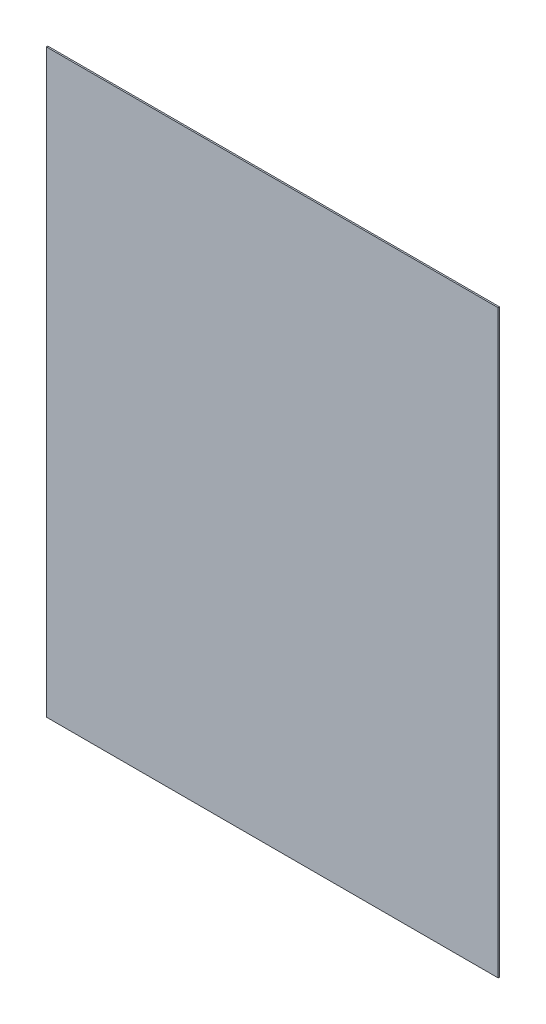
ISO-10303-21;
HEADER;
FILE_DESCRIPTION(('STEP AP214'),'2;1');
FILE_NAME('part.step','',(''),(''),'','','');
FILE_SCHEMA(('AUTOMOTIVE_DESIGN { 1 0 10303 214 1 1 1 1 }'));
ENDSEC;
DATA;
#1=APPLICATION_CONTEXT('core data for automotive mechanical design processes');
#2=APPLICATION_PROTOCOL_DEFINITION('international standard','automotive_design',2000,#1);
#3=PRODUCT_CONTEXT('',#1,'mechanical');
#4=PRODUCT('Part','Part','',(#3));
#5=PRODUCT_RELATED_PRODUCT_CATEGORY('part','',(#4));
#6=PRODUCT_DEFINITION_FORMATION('','',#4);
#7=PRODUCT_DEFINITION_CONTEXT('part definition',#1,'design');
#8=PRODUCT_DEFINITION('design','',#6,#7);
#9=PRODUCT_DEFINITION_SHAPE('','',#8);
#10=(LENGTH_UNIT() NAMED_UNIT(*) SI_UNIT(.MILLI.,.METRE.));
#11=(NAMED_UNIT(*) PLANE_ANGLE_UNIT() SI_UNIT($,.RADIAN.));
#12=(NAMED_UNIT(*) SI_UNIT($,.STERADIAN.) SOLID_ANGLE_UNIT());
#13=UNCERTAINTY_MEASURE_WITH_UNIT(LENGTH_MEASURE(1.E-05),#10,'distance_accuracy_value','');
#14=(GEOMETRIC_REPRESENTATION_CONTEXT(3) GLOBAL_UNCERTAINTY_ASSIGNED_CONTEXT((#13)) GLOBAL_UNIT_ASSIGNED_CONTEXT((#10,
#11,#12)) REPRESENTATION_CONTEXT('',''));
#15=CARTESIAN_POINT('',(0.,0.,0.));
#16=DIRECTION('',(0.,0.,1.));
#17=DIRECTION('',(1.,0.,0.));
#18=AXIS2_PLACEMENT_3D('',#15,#16,#17);
#19=CARTESIAN_POINT('',(101.,140.,-54.2249091517434));
#20=DIRECTION('',(0.,1.,0.));
#21=DIRECTION('',(0.,0.,1.));
#22=AXIS2_PLACEMENT_3D('',#19,#20,#21);
#23=PLANE('',#22);
#24=DIRECTION('',(-1.,0.,0.));
#25=VECTOR('',#24,1.);
#26=CARTESIAN_POINT('',(101.,140.,-53.4311591517434));
#27=LINE('',#26,#25);
#28=CARTESIAN_POINT('',(101.,140.,-53.4311591517434));
#29=VERTEX_POINT('',#28);
#30=CARTESIAN_POINT('',(-145.,140.,-53.4311591517434));
#31=VERTEX_POINT('',#30);
#32=EDGE_CURVE('E96',#29,#31,#27,.T.);
#33=ORIENTED_EDGE('',*,*,#32,.F.);
#34=DIRECTION('',(0.,0.,1.));
#35=VECTOR('',#34,1.);
#36=CARTESIAN_POINT('',(101.,140.,-54.2249091517434));
#37=LINE('',#36,#35);
#38=CARTESIAN_POINT('',(101.,140.,-54.2249091517434));
#39=VERTEX_POINT('',#38);
#40=EDGE_CURVE('E11',#39,#29,#37,.T.);
#41=ORIENTED_EDGE('',*,*,#40,.F.);
#42=DIRECTION('',(-1.,0.,0.));
#43=VECTOR('',#42,1.);
#44=CARTESIAN_POINT('',(101.,140.,-54.2249091517434));
#45=LINE('',#44,#43);
#46=CARTESIAN_POINT('',(-145.,140.,-54.2249091517434));
#47=VERTEX_POINT('',#46);
#48=EDGE_CURVE('E90',#39,#47,#45,.T.);
#49=ORIENTED_EDGE('',*,*,#48,.T.);
#50=DIRECTION('',(0.,0.,1.));
#51=VECTOR('',#50,1.);
#52=CARTESIAN_POINT('',(-145.,140.,-54.2249091517434));
#53=LINE('',#52,#51);
#54=EDGE_CURVE('E35',#47,#31,#53,.T.);
#55=ORIENTED_EDGE('',*,*,#54,.T.);
#56=EDGE_LOOP('',(#33,#41,#49,#55));
#57=FACE_BOUND('',#56,.T.);
#58=ADVANCED_FACE('F32',(#57),#23,.T.);
#59=CARTESIAN_POINT('',(101.,-176.,-54.2249091517434));
#60=DIRECTION('',(1.,0.,0.));
#61=DIRECTION('',(0.,0.,-1.));
#62=AXIS2_PLACEMENT_3D('',#59,#60,#61);
#63=PLANE('',#62);
#64=DIRECTION('',(0.,1.,0.));
#65=VECTOR('',#64,1.);
#66=CARTESIAN_POINT('',(101.,-176.,-53.4311591517434));
#67=LINE('',#66,#65);
#68=CARTESIAN_POINT('',(101.,-176.,-53.4311591517434));
#69=VERTEX_POINT('',#68);
#70=EDGE_CURVE('E92',#69,#29,#67,.T.);
#71=ORIENTED_EDGE('',*,*,#70,.F.);
#72=DIRECTION('',(0.,0.,1.));
#73=VECTOR('',#72,1.);
#74=CARTESIAN_POINT('',(101.,-176.,-54.2249091517434));
#75=LINE('',#74,#73);
#76=CARTESIAN_POINT('',(101.,-176.,-54.2249091517434));
#77=VERTEX_POINT('',#76);
#78=EDGE_CURVE('E41',#77,#69,#75,.T.);
#79=ORIENTED_EDGE('',*,*,#78,.F.);
#80=DIRECTION('',(0.,1.,0.));
#81=VECTOR('',#80,1.);
#82=CARTESIAN_POINT('',(101.,-176.,-54.2249091517434));
#83=LINE('',#82,#81);
#84=EDGE_CURVE('E87',#77,#39,#83,.T.);
#85=ORIENTED_EDGE('',*,*,#84,.T.);
#86=ORIENTED_EDGE('',*,*,#40,.T.);
#87=EDGE_LOOP('',(#71,#79,#85,#86));
#88=FACE_BOUND('',#87,.T.);
#89=ADVANCED_FACE('F106',(#88),#63,.T.);
#90=CARTESIAN_POINT('',(-145.,-176.,-54.2249091517434));
#91=DIRECTION('',(0.,-1.,0.));
#92=DIRECTION('',(0.,0.,-1.));
#93=AXIS2_PLACEMENT_3D('',#90,#91,#92);
#94=PLANE('',#93);
#95=DIRECTION('',(1.,0.,0.));
#96=VECTOR('',#95,1.);
#97=CARTESIAN_POINT('',(-145.,-176.,-53.4311591517434));
#98=LINE('',#97,#96);
#99=CARTESIAN_POINT('',(-145.,-176.,-53.4311591517434));
#100=VERTEX_POINT('',#99);
#101=EDGE_CURVE('E82',#100,#69,#98,.T.);
#102=ORIENTED_EDGE('',*,*,#101,.F.);
#103=DIRECTION('',(0.,0.,1.));
#104=VECTOR('',#103,1.);
#105=CARTESIAN_POINT('',(-145.,-176.,-54.2249091517434));
#106=LINE('',#105,#104);
#107=CARTESIAN_POINT('',(-145.,-176.,-54.2249091517434));
#108=VERTEX_POINT('',#107);
#109=EDGE_CURVE('E77',#108,#100,#106,.T.);
#110=ORIENTED_EDGE('',*,*,#109,.F.);
#111=DIRECTION('',(1.,0.,0.));
#112=VECTOR('',#111,1.);
#113=CARTESIAN_POINT('',(-145.,-176.,-54.2249091517434));
#114=LINE('',#113,#112);
#115=EDGE_CURVE('E80',#108,#77,#114,.T.);
#116=ORIENTED_EDGE('',*,*,#115,.T.);
#117=ORIENTED_EDGE('',*,*,#78,.T.);
#118=EDGE_LOOP('',(#102,#110,#116,#117));
#119=FACE_BOUND('',#118,.T.);
#120=ADVANCED_FACE('F79',(#119),#94,.T.);
#121=CARTESIAN_POINT('',(-145.,140.,-54.2249091517434));
#122=DIRECTION('',(-1.,0.,0.));
#123=DIRECTION('',(0.,0.,1.));
#124=AXIS2_PLACEMENT_3D('',#121,#122,#123);
#125=PLANE('',#124);
#126=DIRECTION('',(0.,-1.,0.));
#127=VECTOR('',#126,1.);
#128=CARTESIAN_POINT('',(-145.,140.,-53.4311591517434));
#129=LINE('',#128,#127);
#130=EDGE_CURVE('E99',#31,#100,#129,.T.);
#131=ORIENTED_EDGE('',*,*,#130,.F.);
#132=ORIENTED_EDGE('',*,*,#54,.F.);
#133=DIRECTION('',(0.,-1.,0.));
#134=VECTOR('',#133,1.);
#135=CARTESIAN_POINT('',(-145.,140.,-54.2249091517434));
#136=LINE('',#135,#134);
#137=EDGE_CURVE('E86',#47,#108,#136,.T.);
#138=ORIENTED_EDGE('',*,*,#137,.T.);
#139=ORIENTED_EDGE('',*,*,#109,.T.);
#140=EDGE_LOOP('',(#131,#132,#138,#139));
#141=FACE_BOUND('',#140,.T.);
#142=ADVANCED_FACE('F89',(#141),#125,.T.);
#143=CARTESIAN_POINT('',(0.,0.,-54.2249091517434));
#144=DIRECTION('',(0.,0.,1.));
#145=DIRECTION('',(1.,0.,0.));
#146=AXIS2_PLACEMENT_3D('',#143,#144,#145);
#147=PLANE('',#146);
#148=ORIENTED_EDGE('',*,*,#48,.F.);
#149=ORIENTED_EDGE('',*,*,#84,.F.);
#150=ORIENTED_EDGE('',*,*,#115,.F.);
#151=ORIENTED_EDGE('',*,*,#137,.F.);
#152=EDGE_LOOP('',(#148,#149,#150,#151));
#153=FACE_BOUND('',#152,.T.);
#154=ADVANCED_FACE('F85',(#153),#147,.F.);
#155=CARTESIAN_POINT('',(0.,0.,-53.4311591517434));
#156=DIRECTION('',(0.,0.,1.));
#157=DIRECTION('',(1.,0.,0.));
#158=AXIS2_PLACEMENT_3D('',#155,#156,#157);
#159=PLANE('',#158);
#160=ORIENTED_EDGE('',*,*,#32,.T.);
#161=ORIENTED_EDGE('',*,*,#130,.T.);
#162=ORIENTED_EDGE('',*,*,#101,.T.);
#163=ORIENTED_EDGE('',*,*,#70,.T.);
#164=EDGE_LOOP('',(#160,#161,#162,#163));
#165=FACE_BOUND('',#164,.T.);
#166=ADVANCED_FACE('F105',(#165),#159,.T.);
#167=CLOSED_SHELL('',(#58,#89,#120,#142,#154,#166));
#168=MANIFOLD_SOLID_BREP('B2',#167);
#169=ADVANCED_BREP_SHAPE_REPRESENTATION('',(#18,#168),#14);
#170=SHAPE_DEFINITION_REPRESENTATION(#9,#169);
ENDSEC;
END-ISO-10303-21;
